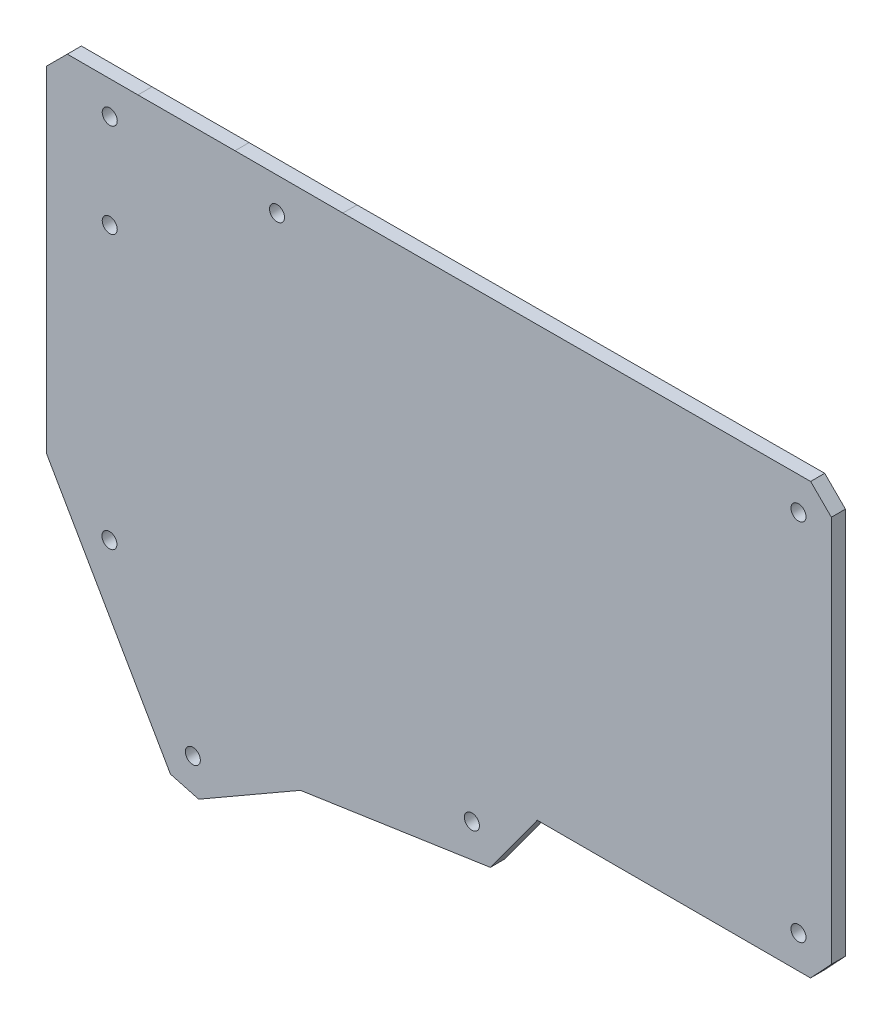
ISO-10303-21;
HEADER;
FILE_DESCRIPTION(('STEP AP214'),'2;1');
FILE_NAME('part.step','',(''),(''),'','','');
FILE_SCHEMA(('AUTOMOTIVE_DESIGN { 1 0 10303 214 1 1 1 1 }'));
ENDSEC;
DATA;
#1=APPLICATION_CONTEXT('core data for automotive mechanical design processes');
#2=APPLICATION_PROTOCOL_DEFINITION('international standard','automotive_design',2000,#1);
#3=PRODUCT_CONTEXT('',#1,'mechanical');
#4=PRODUCT('Part','Part','',(#3));
#5=PRODUCT_RELATED_PRODUCT_CATEGORY('part','',(#4));
#6=PRODUCT_DEFINITION_FORMATION('','',#4);
#7=PRODUCT_DEFINITION_CONTEXT('part definition',#1,'design');
#8=PRODUCT_DEFINITION('design','',#6,#7);
#9=PRODUCT_DEFINITION_SHAPE('','',#8);
#10=(LENGTH_UNIT() NAMED_UNIT(*) SI_UNIT(.MILLI.,.METRE.));
#11=(NAMED_UNIT(*) PLANE_ANGLE_UNIT() SI_UNIT($,.RADIAN.));
#12=(NAMED_UNIT(*) SI_UNIT($,.STERADIAN.) SOLID_ANGLE_UNIT());
#13=UNCERTAINTY_MEASURE_WITH_UNIT(LENGTH_MEASURE(1.E-05),#10,'distance_accuracy_value','');
#14=(GEOMETRIC_REPRESENTATION_CONTEXT(3) GLOBAL_UNCERTAINTY_ASSIGNED_CONTEXT((#13)) GLOBAL_UNIT_ASSIGNED_CONTEXT((#10,
#11,#12)) REPRESENTATION_CONTEXT('',''));
#15=CARTESIAN_POINT('',(0.,0.,0.));
#16=DIRECTION('',(0.,0.,1.));
#17=DIRECTION('',(1.,0.,0.));
#18=AXIS2_PLACEMENT_3D('',#15,#16,#17);
#19=CARTESIAN_POINT('',(7.66089303925564,0.,3.));
#20=DIRECTION('',(-1.,0.,0.));
#21=DIRECTION('',(0.,0.,1.));
#22=AXIS2_PLACEMENT_3D('',#19,#20,#21);
#23=PLANE('',#22);
#24=DIRECTION('',(0.,1.,0.));
#25=VECTOR('',#24,1.);
#26=CARTESIAN_POINT('',(7.66089303925564,0.,0.));
#27=LINE('',#26,#25);
#28=CARTESIAN_POINT('',(7.66089303925565,-81.1960721287899,0.));
#29=VERTEX_POINT('',#28);
#30=CARTESIAN_POINT('',(7.66089303925564,1.26724378586505,0.));
#31=VERTEX_POINT('',#30);
#32=EDGE_CURVE('E198',#29,#31,#27,.T.);
#33=ORIENTED_EDGE('',*,*,#32,.T.);
#34=DIRECTION('',(0.,0.,-1.));
#35=VECTOR('',#34,1.);
#36=CARTESIAN_POINT('',(7.66089303925564,1.26724378586505,3.));
#37=LINE('',#36,#35);
#38=CARTESIAN_POINT('',(7.66089303925564,1.26724378586505,3.));
#39=VERTEX_POINT('',#38);
#40=EDGE_CURVE('E11',#39,#31,#37,.T.);
#41=ORIENTED_EDGE('',*,*,#40,.F.);
#42=DIRECTION('',(0.,1.,0.));
#43=VECTOR('',#42,1.);
#44=CARTESIAN_POINT('',(7.66089303925564,0.,3.));
#45=LINE('',#44,#43);
#46=CARTESIAN_POINT('',(7.66089303925565,-81.1960721287899,3.));
#47=VERTEX_POINT('',#46);
#48=EDGE_CURVE('E600',#47,#39,#45,.T.);
#49=ORIENTED_EDGE('',*,*,#48,.F.);
#50=DIRECTION('',(0.,0.,-1.));
#51=VECTOR('',#50,1.);
#52=CARTESIAN_POINT('',(7.66089303925565,-81.1960721287899,3.));
#53=LINE('',#52,#51);
#54=EDGE_CURVE('E51',#47,#29,#53,.T.);
#55=ORIENTED_EDGE('',*,*,#54,.T.);
#56=EDGE_LOOP('',(#33,#41,#49,#55));
#57=FACE_BOUND('',#56,.T.);
#58=ADVANCED_FACE('F34',(#57),#23,.F.);
#59=CARTESIAN_POINT('',(4.4524616072334,4.46597032094939,3.));
#60=DIRECTION('',(-0.706034919401094,-0.708177020656764,0.));
#61=DIRECTION('',(0.708177020656764,-0.706034919401094,0.));
#62=AXIS2_PLACEMENT_3D('',#59,#60,#61);
#63=PLANE('',#62);
#64=DIRECTION('',(-0.708177020656764,0.706034919401094,0.));
#65=VECTOR('',#64,1.);
#66=CARTESIAN_POINT('',(4.4524616072334,4.46597032094939,0.));
#67=LINE('',#66,#65);
#68=CARTESIAN_POINT('',(3.24884614344241,5.6659450761024,0.));
#69=VERTEX_POINT('',#68);
#70=EDGE_CURVE('E200',#31,#69,#67,.T.);
#71=ORIENTED_EDGE('',*,*,#70,.T.);
#72=DIRECTION('',(0.,0.,-1.));
#73=VECTOR('',#72,1.);
#74=CARTESIAN_POINT('',(3.24884614344241,5.6659450761024,3.));
#75=LINE('',#74,#73);
#76=CARTESIAN_POINT('',(3.24884614344241,5.6659450761024,3.));
#77=VERTEX_POINT('',#76);
#78=EDGE_CURVE('E43',#77,#69,#75,.T.);
#79=ORIENTED_EDGE('',*,*,#78,.F.);
#80=DIRECTION('',(-0.708177020656764,0.706034919401094,0.));
#81=VECTOR('',#80,1.);
#82=CARTESIAN_POINT('',(4.4524616072334,4.46597032094939,3.));
#83=LINE('',#82,#81);
#84=EDGE_CURVE('E110',#39,#77,#83,.T.);
#85=ORIENTED_EDGE('',*,*,#84,.F.);
#86=ORIENTED_EDGE('',*,*,#40,.T.);
#87=EDGE_LOOP('',(#71,#79,#85,#86));
#88=FACE_BOUND('',#87,.T.);
#89=ADVANCED_FACE('F318',(#88),#63,.F.);
#90=CARTESIAN_POINT('',(-0.0171344360139464,5.65605111756165,3.));
#91=DIRECTION('',(0.00302938517258272,-0.99999541140221,0.));
#92=DIRECTION('',(0.99999541140221,0.00302938517258272,0.));
#93=AXIS2_PLACEMENT_3D('',#90,#91,#92);
#94=PLANE('',#93);
#95=DIRECTION('',(-0.99999541140221,-0.00302938517258272,0.));
#96=VECTOR('',#95,1.);
#97=CARTESIAN_POINT('',(-0.0171344360139464,5.65605111756165,0.));
#98=LINE('',#97,#96);
#99=CARTESIAN_POINT('',(-96.3671470307811,5.36416847869687,0.));
#100=VERTEX_POINT('',#99);
#101=EDGE_CURVE('E202',#69,#100,#98,.T.);
#102=ORIENTED_EDGE('',*,*,#101,.T.);
#103=DIRECTION('',(0.,0.,-1.));
#104=VECTOR('',#103,1.);
#105=CARTESIAN_POINT('',(-96.3671470307811,5.36416847869687,3.));
#106=LINE('',#105,#104);
#107=CARTESIAN_POINT('',(-96.3671470307811,5.36416847869687,3.));
#108=VERTEX_POINT('',#107);
#109=EDGE_CURVE('E257',#108,#100,#106,.T.);
#110=ORIENTED_EDGE('',*,*,#109,.F.);
#111=DIRECTION('',(-0.99999541140221,-0.00302938517258272,0.));
#112=VECTOR('',#111,1.);
#113=CARTESIAN_POINT('',(-0.0171344360139464,5.65605111756165,3.));
#114=LINE('',#113,#112);
#115=EDGE_CURVE('E264',#77,#108,#114,.T.);
#116=ORIENTED_EDGE('',*,*,#115,.F.);
#117=ORIENTED_EDGE('',*,*,#78,.T.);
#118=EDGE_LOOP('',(#102,#110,#116,#117));
#119=FACE_BOUND('',#118,.T.);
#120=ADVANCED_FACE('F262',(#119),#94,.F.);
#121=CARTESIAN_POINT('',(0.,5.36416847869687,3.));
#122=DIRECTION('',(0.,1.,0.));
#123=DIRECTION('',(0.,0.,1.));
#124=AXIS2_PLACEMENT_3D('',#121,#122,#123);
#125=PLANE('',#124);
#126=DIRECTION('',(1.,0.,0.));
#127=VECTOR('',#126,1.);
#128=CARTESIAN_POINT('',(0.,5.36416847869687,0.));
#129=LINE('',#128,#127);
#130=CARTESIAN_POINT('',(-119.344550333397,5.36416847869687,0.));
#131=VERTEX_POINT('',#130);
#132=EDGE_CURVE('E205',#131,#100,#129,.T.);
#133=ORIENTED_EDGE('',*,*,#132,.F.);
#134=DIRECTION('',(0.,0.,-1.));
#135=VECTOR('',#134,1.);
#136=CARTESIAN_POINT('',(-119.344550333397,5.36416847869687,3.));
#137=LINE('',#136,#135);
#138=CARTESIAN_POINT('',(-119.344550333397,5.36416847869687,3.));
#139=VERTEX_POINT('',#138);
#140=EDGE_CURVE('E255',#139,#131,#137,.T.);
#141=ORIENTED_EDGE('',*,*,#140,.F.);
#142=DIRECTION('',(1.,0.,0.));
#143=VECTOR('',#142,1.);
#144=CARTESIAN_POINT('',(0.,5.36416847869687,3.));
#145=LINE('',#144,#143);
#146=EDGE_CURVE('E274',#139,#108,#145,.T.);
#147=ORIENTED_EDGE('',*,*,#146,.T.);
#148=ORIENTED_EDGE('',*,*,#109,.T.);
#149=EDGE_LOOP('',(#133,#141,#147,#148));
#150=FACE_BOUND('',#149,.T.);
#151=ADVANCED_FACE('F271',(#150),#125,.T.);
#152=CARTESIAN_POINT('',(-0.0117608863754863,5.61415436888448,3.));
#153=DIRECTION('',(-0.00209485877957112,0.999997805780939,0.));
#154=DIRECTION('',(-0.99999780578094,-0.00209485877957112,0.));
#155=AXIS2_PLACEMENT_3D('',#152,#153,#154);
#156=PLANE('',#155);
#157=DIRECTION('',(0.99999780578094,0.00209485877957112,0.));
#158=VECTOR('',#157,1.);
#159=CARTESIAN_POINT('',(-0.0117608863754863,5.61415436888448,0.));
#160=LINE('',#159,#158);
#161=CARTESIAN_POINT('',(-140.021777649489,5.32085251247185,0.));
#162=VERTEX_POINT('',#161);
#163=EDGE_CURVE('E208',#162,#131,#160,.T.);
#164=ORIENTED_EDGE('',*,*,#163,.F.);
#165=DIRECTION('',(0.,0.,-1.));
#166=VECTOR('',#165,1.);
#167=CARTESIAN_POINT('',(-140.021777649489,5.32085251247185,3.));
#168=LINE('',#167,#166);
#169=CARTESIAN_POINT('',(-140.021777649489,5.32085251247185,3.));
#170=VERTEX_POINT('',#169);
#171=EDGE_CURVE('E253',#170,#162,#168,.T.);
#172=ORIENTED_EDGE('',*,*,#171,.F.);
#173=DIRECTION('',(0.99999780578094,0.00209485877957112,0.));
#174=VECTOR('',#173,1.);
#175=CARTESIAN_POINT('',(-0.0117608863754863,5.61415436888448,3.));
#176=LINE('',#175,#174);
#177=EDGE_CURVE('E277',#170,#139,#176,.T.);
#178=ORIENTED_EDGE('',*,*,#177,.T.);
#179=ORIENTED_EDGE('',*,*,#140,.T.);
#180=EDGE_LOOP('',(#164,#172,#178,#179));
#181=FACE_BOUND('',#180,.T.);
#182=ADVANCED_FACE('F519',(#181),#156,.T.);
#183=CARTESIAN_POINT('',(0.,5.32085251247185,3.));
#184=DIRECTION('',(0.,-1.,0.));
#185=DIRECTION('',(0.,0.,-1.));
#186=AXIS2_PLACEMENT_3D('',#183,#184,#185);
#187=PLANE('',#186);
#188=DIRECTION('',(-1.,0.,0.));
#189=VECTOR('',#188,1.);
#190=CARTESIAN_POINT('',(0.,5.32085251247185,0.));
#191=LINE('',#190,#189);
#192=CARTESIAN_POINT('',(-155.064772312705,5.32085251247185,0.));
#193=VERTEX_POINT('',#192);
#194=EDGE_CURVE('E211',#162,#193,#191,.T.);
#195=ORIENTED_EDGE('',*,*,#194,.T.);
#196=DIRECTION('',(0.,0.,-1.));
#197=VECTOR('',#196,1.);
#198=CARTESIAN_POINT('',(-155.064772312705,5.32085251247185,3.));
#199=LINE('',#198,#197);
#200=CARTESIAN_POINT('',(-155.064772312705,5.32085251247185,3.));
#201=VERTEX_POINT('',#200);
#202=EDGE_CURVE('E250',#201,#193,#199,.T.);
#203=ORIENTED_EDGE('',*,*,#202,.F.);
#204=DIRECTION('',(-1.,0.,0.));
#205=VECTOR('',#204,1.);
#206=CARTESIAN_POINT('',(0.,5.32085251247185,3.));
#207=LINE('',#206,#205);
#208=EDGE_CURVE('E279',#170,#201,#207,.T.);
#209=ORIENTED_EDGE('',*,*,#208,.F.);
#210=ORIENTED_EDGE('',*,*,#171,.T.);
#211=EDGE_LOOP('',(#195,#203,#209,#210));
#212=FACE_BOUND('',#211,.T.);
#213=ADVANCED_FACE('F509',(#212),#187,.F.);
#214=CARTESIAN_POINT('',(-80.1928124125885,80.1928124125884,3.));
#215=DIRECTION('',(0.707106781186548,-0.707106781186547,0.));
#216=DIRECTION('',(0.707106781186547,0.707106781186548,0.));
#217=AXIS2_PLACEMENT_3D('',#214,#215,#216);
#218=PLANE('',#217);
#219=DIRECTION('',(-0.707106781186547,-0.707106781186548,0.));
#220=VECTOR('',#219,1.);
#221=CARTESIAN_POINT('',(-80.1928124125885,80.1928124125884,0.));
#222=LINE('',#221,#220);
#223=CARTESIAN_POINT('',(-159.478985875078,0.906638950098765,0.));
#224=VERTEX_POINT('',#223);
#225=EDGE_CURVE('E213',#193,#224,#222,.T.);
#226=ORIENTED_EDGE('',*,*,#225,.T.);
#227=DIRECTION('',(0.,0.,-1.));
#228=VECTOR('',#227,1.);
#229=CARTESIAN_POINT('',(-159.478985875078,0.906638950098765,3.));
#230=LINE('',#229,#228);
#231=CARTESIAN_POINT('',(-159.478985875078,0.906638950098765,3.));
#232=VERTEX_POINT('',#231);
#233=EDGE_CURVE('E247',#232,#224,#230,.T.);
#234=ORIENTED_EDGE('',*,*,#233,.F.);
#235=DIRECTION('',(-0.707106781186547,-0.707106781186548,0.));
#236=VECTOR('',#235,1.);
#237=CARTESIAN_POINT('',(-80.1928124125885,80.1928124125884,3.));
#238=LINE('',#237,#236);
#239=EDGE_CURVE('E285',#201,#232,#238,.T.);
#240=ORIENTED_EDGE('',*,*,#239,.F.);
#241=ORIENTED_EDGE('',*,*,#202,.T.);
#242=EDGE_LOOP('',(#226,#234,#240,#241));
#243=FACE_BOUND('',#242,.T.);
#244=ADVANCED_FACE('F498',(#243),#218,.F.);
#245=CARTESIAN_POINT('',(-159.478985875078,0.,3.));
#246=DIRECTION('',(1.,0.,0.));
#247=DIRECTION('',(0.,0.,-1.));
#248=AXIS2_PLACEMENT_3D('',#245,#246,#247);
#249=PLANE('',#248);
#250=DIRECTION('',(0.,-1.,0.));
#251=VECTOR('',#250,1.);
#252=CARTESIAN_POINT('',(-159.478985875078,0.,0.));
#253=LINE('',#252,#251);
#254=CARTESIAN_POINT('',(-159.478985875078,-70.5743208912734,0.));
#255=VERTEX_POINT('',#254);
#256=EDGE_CURVE('E215',#224,#255,#253,.T.);
#257=ORIENTED_EDGE('',*,*,#256,.T.);
#258=DIRECTION('',(0.,0.,-1.));
#259=VECTOR('',#258,1.);
#260=CARTESIAN_POINT('',(-159.478985875078,-70.5743208912734,3.));
#261=LINE('',#260,#259);
#262=CARTESIAN_POINT('',(-159.478985875078,-70.5743208912734,3.));
#263=VERTEX_POINT('',#262);
#264=EDGE_CURVE('E244',#263,#255,#261,.T.);
#265=ORIENTED_EDGE('',*,*,#264,.F.);
#266=DIRECTION('',(0.,-1.,0.));
#267=VECTOR('',#266,1.);
#268=CARTESIAN_POINT('',(-159.478985875078,0.,3.));
#269=LINE('',#268,#267);
#270=EDGE_CURVE('E287',#232,#263,#269,.T.);
#271=ORIENTED_EDGE('',*,*,#270,.F.);
#272=ORIENTED_EDGE('',*,*,#233,.T.);
#273=EDGE_LOOP('',(#257,#265,#271,#272));
#274=FACE_BOUND('',#273,.T.);
#275=ADVANCED_FACE('F488',(#274),#249,.F.);
#276=CARTESIAN_POINT('',(-150.385282970097,-86.4021560626533,3.));
#277=DIRECTION('',(0.867079117153433,0.498170457370188,0.));
#278=DIRECTION('',(-0.498170457370188,0.867079117153434,0.));
#279=AXIS2_PLACEMENT_3D('',#276,#277,#278);
#280=PLANE('',#279);
#281=DIRECTION('',(0.498170457370188,-0.867079117153434,0.));
#282=VECTOR('',#281,1.);
#283=CARTESIAN_POINT('',(-150.385282970097,-86.4021560626533,0.));
#284=LINE('',#283,#282);
#285=CARTESIAN_POINT('',(-133.100653392858,-116.486520023682,0.));
#286=VERTEX_POINT('',#285);
#287=EDGE_CURVE('E217',#255,#286,#284,.T.);
#288=ORIENTED_EDGE('',*,*,#287,.T.);
#289=DIRECTION('',(0.,0.,-1.));
#290=VECTOR('',#289,1.);
#291=CARTESIAN_POINT('',(-133.100653392858,-116.486520023682,3.));
#292=LINE('',#291,#290);
#293=CARTESIAN_POINT('',(-133.100653392858,-116.486520023682,3.));
#294=VERTEX_POINT('',#293);
#295=EDGE_CURVE('E241',#294,#286,#292,.T.);
#296=ORIENTED_EDGE('',*,*,#295,.F.);
#297=DIRECTION('',(0.498170457370188,-0.867079117153434,0.));
#298=VECTOR('',#297,1.);
#299=CARTESIAN_POINT('',(-150.385282970097,-86.4021560626533,3.));
#300=LINE('',#299,#298);
#301=EDGE_CURVE('E289',#263,#294,#300,.T.);
#302=ORIENTED_EDGE('',*,*,#301,.F.);
#303=ORIENTED_EDGE('',*,*,#264,.T.);
#304=EDGE_LOOP('',(#288,#296,#302,#303));
#305=FACE_BOUND('',#304,.T.);
#306=ADVANCED_FACE('F478',(#305),#280,.F.);
#307=CARTESIAN_POINT('',(-38.3262179573216,-142.056284095759,3.));
#308=DIRECTION('',(0.260482277203311,0.965478629107334,0.));
#309=DIRECTION('',(-0.965478629107334,0.260482277203311,0.));
#310=AXIS2_PLACEMENT_3D('',#307,#308,#309);
#311=PLANE('',#310);
#312=DIRECTION('',(0.965478629107334,-0.260482277203311,0.));
#313=VECTOR('',#312,1.);
#314=CARTESIAN_POINT('',(-38.3262179573216,-142.056284095759,0.));
#315=LINE('',#314,#313);
#316=CARTESIAN_POINT('',(-127.076613357529,-118.111781960155,0.));
#317=VERTEX_POINT('',#316);
#318=EDGE_CURVE('E219',#286,#317,#315,.T.);
#319=ORIENTED_EDGE('',*,*,#318,.T.);
#320=DIRECTION('',(0.,0.,-1.));
#321=VECTOR('',#320,1.);
#322=CARTESIAN_POINT('',(-127.076613357529,-118.111781960155,3.));
#323=LINE('',#322,#321);
#324=CARTESIAN_POINT('',(-127.076613357529,-118.111781960155,3.));
#325=VERTEX_POINT('',#324);
#326=EDGE_CURVE('E238',#325,#317,#323,.T.);
#327=ORIENTED_EDGE('',*,*,#326,.F.);
#328=DIRECTION('',(0.965478629107334,-0.260482277203311,0.));
#329=VECTOR('',#328,1.);
#330=CARTESIAN_POINT('',(-38.3262179573216,-142.056284095759,3.));
#331=LINE('',#330,#329);
#332=EDGE_CURVE('E291',#294,#325,#331,.T.);
#333=ORIENTED_EDGE('',*,*,#332,.F.);
#334=ORIENTED_EDGE('',*,*,#295,.T.);
#335=EDGE_LOOP('',(#319,#327,#333,#334));
#336=FACE_BOUND('',#335,.T.);
#337=ADVANCED_FACE('F469',(#336),#311,.F.);
#338=CARTESIAN_POINT('',(19.4424470319471,-33.7792379449592,3.));
#339=DIRECTION('',(-0.498844869486857,0.86669129232192,0.));
#340=DIRECTION('',(-0.86669129232192,-0.498844869486857,0.));
#341=AXIS2_PLACEMENT_3D('',#338,#339,#340);
#342=PLANE('',#341);
#343=DIRECTION('',(0.86669129232192,0.498844869486857,0.));
#344=VECTOR('',#343,1.);
#345=CARTESIAN_POINT('',(19.4424470319471,-33.7792379449592,0.));
#346=LINE('',#345,#344);
#347=CARTESIAN_POINT('',(-105.412894174079,-105.642711064432,0.));
#348=VERTEX_POINT('',#347);
#349=EDGE_CURVE('E221',#317,#348,#346,.T.);
#350=ORIENTED_EDGE('',*,*,#349,.T.);
#351=DIRECTION('',(0.,0.,-1.));
#352=VECTOR('',#351,1.);
#353=CARTESIAN_POINT('',(-105.412894174079,-105.642711064432,3.));
#354=LINE('',#353,#352);
#355=CARTESIAN_POINT('',(-105.412894174079,-105.642711064432,3.));
#356=VERTEX_POINT('',#355);
#357=EDGE_CURVE('E235',#356,#348,#354,.T.);
#358=ORIENTED_EDGE('',*,*,#357,.F.);
#359=DIRECTION('',(0.86669129232192,0.498844869486857,0.));
#360=VECTOR('',#359,1.);
#361=CARTESIAN_POINT('',(19.4424470319471,-33.7792379449592,3.));
#362=LINE('',#361,#360);
#363=EDGE_CURVE('E293',#325,#356,#362,.T.);
#364=ORIENTED_EDGE('',*,*,#363,.F.);
#365=ORIENTED_EDGE('',*,*,#326,.T.);
#366=EDGE_LOOP('',(#350,#358,#364,#365));
#367=FACE_BOUND('',#366,.T.);
#368=ADVANCED_FACE('F299',(#367),#342,.F.);
#369=CARTESIAN_POINT('',(13.0852967169432,-88.0280539294065,3.));
#370=DIRECTION('',(-0.147033571925685,0.989131502241625,0.));
#371=DIRECTION('',(-0.989131502241625,-0.147033571925685,0.));
#372=AXIS2_PLACEMENT_3D('',#369,#370,#371);
#373=PLANE('',#372);
#374=DIRECTION('',(0.989131502241625,0.147033571925685,0.));
#375=VECTOR('',#374,1.);
#376=CARTESIAN_POINT('',(13.0852967169432,-88.0280539294065,0.));
#377=LINE('',#376,#375);
#378=CARTESIAN_POINT('',(-64.9706233499997,-99.6310012740001,0.));
#379=VERTEX_POINT('',#378);
#380=EDGE_CURVE('E223',#348,#379,#377,.T.);
#381=ORIENTED_EDGE('',*,*,#380,.T.);
#382=DIRECTION('',(0.,0.,-1.));
#383=VECTOR('',#382,1.);
#384=CARTESIAN_POINT('',(-64.9706233499997,-99.6310012740001,3.));
#385=LINE('',#384,#383);
#386=CARTESIAN_POINT('',(-64.9706233499997,-99.6310012740001,3.));
#387=VERTEX_POINT('',#386);
#388=EDGE_CURVE('E166',#387,#379,#385,.T.);
#389=ORIENTED_EDGE('',*,*,#388,.F.);
#390=DIRECTION('',(0.989131502241625,0.147033571925685,0.));
#391=VECTOR('',#390,1.);
#392=CARTESIAN_POINT('',(13.0852967169432,-88.0280539294065,3.));
#393=LINE('',#392,#391);
#394=EDGE_CURVE('E154',#356,#387,#393,.T.);
#395=ORIENTED_EDGE('',*,*,#394,.F.);
#396=ORIENTED_EDGE('',*,*,#357,.T.);
#397=EDGE_LOOP('',(#381,#389,#395,#396));
#398=FACE_BOUND('',#397,.T.);
#399=ADVANCED_FACE('F303',(#398),#373,.F.);
#400=CARTESIAN_POINT('',(5.06145758509057,-3.6947927449223,3.));
#401=DIRECTION('',(-0.807692408581894,0.589604081667672,0.));
#402=DIRECTION('',(-0.589604081667672,-0.807692408581894,0.));
#403=AXIS2_PLACEMENT_3D('',#400,#401,#402);
#404=PLANE('',#403);
#405=DIRECTION('',(0.589604081667672,0.807692408581894,0.));
#406=VECTOR('',#405,1.);
#407=CARTESIAN_POINT('',(5.06145758509057,-3.6947927449223,0.));
#408=LINE('',#407,#406);
#409=CARTESIAN_POINT('',(-54.9717380120555,-85.9336337814013,0.));
#410=VERTEX_POINT('',#409);
#411=EDGE_CURVE('E163',#379,#410,#408,.T.);
#412=ORIENTED_EDGE('',*,*,#411,.T.);
#413=DIRECTION('',(0.,0.,-1.));
#414=VECTOR('',#413,1.);
#415=CARTESIAN_POINT('',(-54.9717380120555,-85.9336337814013,3.));
#416=LINE('',#415,#414);
#417=CARTESIAN_POINT('',(-54.9717380120555,-85.9336337814013,3.));
#418=VERTEX_POINT('',#417);
#419=EDGE_CURVE('E160',#418,#410,#416,.T.);
#420=ORIENTED_EDGE('',*,*,#419,.F.);
#421=DIRECTION('',(0.589604081667672,0.807692408581894,0.));
#422=VECTOR('',#421,1.);
#423=CARTESIAN_POINT('',(5.06145758509057,-3.6947927449223,3.));
#424=LINE('',#423,#422);
#425=EDGE_CURVE('E147',#387,#418,#424,.T.);
#426=ORIENTED_EDGE('',*,*,#425,.F.);
#427=ORIENTED_EDGE('',*,*,#388,.T.);
#428=EDGE_LOOP('',(#412,#420,#426,#427));
#429=FACE_BOUND('',#428,.T.);
#430=ADVANCED_FACE('F161',(#429),#404,.F.);
#431=CARTESIAN_POINT('',(0.,-85.9336337814013,3.));
#432=DIRECTION('',(0.,-1.,0.));
#433=DIRECTION('',(0.,0.,-1.));
#434=AXIS2_PLACEMENT_3D('',#431,#432,#433);
#435=PLANE('',#434);
#436=DIRECTION('',(-1.,0.,0.));
#437=VECTOR('',#436,1.);
#438=CARTESIAN_POINT('',(0.,-85.9336337814013,0.));
#439=LINE('',#438,#437);
#440=CARTESIAN_POINT('',(3.22714570308626,-85.9336337814013,0.));
#441=VERTEX_POINT('',#440);
#442=EDGE_CURVE('E226',#441,#410,#439,.T.);
#443=ORIENTED_EDGE('',*,*,#442,.F.);
#444=DIRECTION('',(0.,0.,-1.));
#445=VECTOR('',#444,1.);
#446=CARTESIAN_POINT('',(3.22714570308626,-85.9336337814013,3.));
#447=LINE('',#446,#445);
#448=CARTESIAN_POINT('',(3.22714570308626,-85.9336337814013,3.));
#449=VERTEX_POINT('',#448);
#450=EDGE_CURVE('E98',#449,#441,#447,.T.);
#451=ORIENTED_EDGE('',*,*,#450,.F.);
#452=DIRECTION('',(-1.,0.,0.));
#453=VECTOR('',#452,1.);
#454=CARTESIAN_POINT('',(0.,-85.9336337814013,3.));
#455=LINE('',#454,#453);
#456=EDGE_CURVE('E152',#449,#418,#455,.T.);
#457=ORIENTED_EDGE('',*,*,#456,.T.);
#458=ORIENTED_EDGE('',*,*,#419,.T.);
#459=EDGE_LOOP('',(#443,#451,#457,#458));
#460=FACE_BOUND('',#459,.T.);
#461=ADVANCED_FACE('F168',(#460),#435,.T.);
#462=CARTESIAN_POINT('',(0.660893039255643,-1.34192698696502,3.));
#463=DIRECTION('',(0.,0.,-1.));
#464=DIRECTION('',(-1.,0.,0.));
#465=AXIS2_PLACEMENT_3D('',#462,#463,#464);
#466=CYLINDRICAL_SURFACE('',#465,1.6);
#467=CARTESIAN_POINT('',(0.660893039255643,-1.34192698696502,3.));
#468=DIRECTION('',(0.,0.,1.));
#469=DIRECTION('',(1.,0.,0.));
#470=AXIS2_PLACEMENT_3D('',#467,#468,#469);
#471=CIRCLE('',#470,1.6);
#472=CARTESIAN_POINT('',(2.26089303925564,-1.34192698696502,3.));
#473=VERTEX_POINT('',#472);
#474=EDGE_CURVE('E597',#473,#473,#471,.T.);
#475=ORIENTED_EDGE('',*,*,#474,.T.);
#476=EDGE_LOOP('',(#475));
#477=FACE_BOUND('',#476,.T.);
#478=CARTESIAN_POINT('',(0.660893039255643,-1.34192698696502,0.));
#479=DIRECTION('',(0.,0.,1.));
#480=DIRECTION('',(1.,0.,0.));
#481=AXIS2_PLACEMENT_3D('',#478,#479,#480);
#482=CIRCLE('',#481,1.6);
#483=CARTESIAN_POINT('',(2.26089303925564,-1.34192698696502,0.));
#484=VERTEX_POINT('',#483);
#485=EDGE_CURVE('E195',#484,#484,#482,.T.);
#486=ORIENTED_EDGE('',*,*,#485,.F.);
#487=EDGE_LOOP('',(#486));
#488=FACE_BOUND('',#487,.T.);
#489=ADVANCED_FACE('F326',(#477,#488),#466,.F.);
#490=CARTESIAN_POINT('',(-110.397084987784,-1.67836592268011,3.));
#491=DIRECTION('',(0.,0.,-1.));
#492=DIRECTION('',(-1.,0.,0.));
#493=AXIS2_PLACEMENT_3D('',#490,#491,#492);
#494=CYLINDRICAL_SURFACE('',#493,1.60000000000001);
#495=CARTESIAN_POINT('',(-110.397084987784,-1.67836592268011,3.));
#496=DIRECTION('',(0.,0.,1.));
#497=DIRECTION('',(1.,0.,0.));
#498=AXIS2_PLACEMENT_3D('',#495,#496,#497);
#499=CIRCLE('',#498,1.60000000000001);
#500=CARTESIAN_POINT('',(-108.797084987784,-1.67836592268011,3.));
#501=VERTEX_POINT('',#500);
#502=EDGE_CURVE('E594',#501,#501,#499,.T.);
#503=ORIENTED_EDGE('',*,*,#502,.T.);
#504=EDGE_LOOP('',(#503));
#505=FACE_BOUND('',#504,.T.);
#506=CARTESIAN_POINT('',(-110.397084987784,-1.67836592268011,0.));
#507=DIRECTION('',(0.,0.,1.));
#508=DIRECTION('',(1.,0.,0.));
#509=AXIS2_PLACEMENT_3D('',#506,#507,#508);
#510=CIRCLE('',#509,1.60000000000001);
#511=CARTESIAN_POINT('',(-108.797084987784,-1.67836592268011,0.));
#512=VERTEX_POINT('',#511);
#513=EDGE_CURVE('E192',#512,#512,#510,.T.);
#514=ORIENTED_EDGE('',*,*,#513,.F.);
#515=EDGE_LOOP('',(#514));
#516=FACE_BOUND('',#515,.T.);
#517=ADVANCED_FACE('F329',(#505,#516),#494,.F.);
#518=CARTESIAN_POINT('',(0.660893039255866,-78.9336337814017,3.));
#519=DIRECTION('',(0.,0.,-1.));
#520=DIRECTION('',(-1.,0.,0.));
#521=AXIS2_PLACEMENT_3D('',#518,#519,#520);
#522=CYLINDRICAL_SURFACE('',#521,1.6);
#523=CARTESIAN_POINT('',(0.660893039255866,-78.9336337814017,3.));
#524=DIRECTION('',(0.,0.,1.));
#525=DIRECTION('',(1.,0.,0.));
#526=AXIS2_PLACEMENT_3D('',#523,#524,#525);
#527=CIRCLE('',#526,1.6);
#528=CARTESIAN_POINT('',(2.26089303925587,-78.9336337814017,3.));
#529=VERTEX_POINT('',#528);
#530=EDGE_CURVE('E591',#529,#529,#527,.T.);
#531=ORIENTED_EDGE('',*,*,#530,.T.);
#532=EDGE_LOOP('',(#531));
#533=FACE_BOUND('',#532,.T.);
#534=CARTESIAN_POINT('',(0.660893039255866,-78.9336337814017,0.));
#535=DIRECTION('',(0.,0.,1.));
#536=DIRECTION('',(1.,0.,0.));
#537=AXIS2_PLACEMENT_3D('',#534,#535,#536);
#538=CIRCLE('',#537,1.6);
#539=CARTESIAN_POINT('',(2.26089303925587,-78.9336337814017,0.));
#540=VERTEX_POINT('',#539);
#541=EDGE_CURVE('E189',#540,#540,#538,.T.);
#542=ORIENTED_EDGE('',*,*,#541,.F.);
#543=EDGE_LOOP('',(#542));
#544=FACE_BOUND('',#543,.T.);
#545=ADVANCED_FACE('F333',(#533,#544),#522,.F.);
#546=CARTESIAN_POINT('',(-68.8973348654548,-93.1377882225448,3.));
#547=DIRECTION('',(0.,0.,-1.));
#548=DIRECTION('',(-1.,0.,0.));
#549=AXIS2_PLACEMENT_3D('',#546,#547,#548);
#550=CYLINDRICAL_SURFACE('',#549,1.60000000000001);
#551=CARTESIAN_POINT('',(-68.8973348654548,-93.1377882225448,3.));
#552=DIRECTION('',(0.,0.,1.));
#553=DIRECTION('',(1.,0.,0.));
#554=AXIS2_PLACEMENT_3D('',#551,#552,#553);
#555=CIRCLE('',#554,1.60000000000001);
#556=CARTESIAN_POINT('',(-67.2973348654548,-93.1377882225448,3.));
#557=VERTEX_POINT('',#556);
#558=EDGE_CURVE('E588',#557,#557,#555,.T.);
#559=ORIENTED_EDGE('',*,*,#558,.T.);
#560=EDGE_LOOP('',(#559));
#561=FACE_BOUND('',#560,.T.);
#562=CARTESIAN_POINT('',(-68.8973348654548,-93.1377882225448,0.));
#563=DIRECTION('',(0.,0.,1.));
#564=DIRECTION('',(1.,0.,0.));
#565=AXIS2_PLACEMENT_3D('',#562,#563,#564);
#566=CIRCLE('',#565,1.60000000000001);
#567=CARTESIAN_POINT('',(-67.2973348654548,-93.1377882225448,0.));
#568=VERTEX_POINT('',#567);
#569=EDGE_CURVE('E186',#568,#568,#566,.T.);
#570=ORIENTED_EDGE('',*,*,#569,.F.);
#571=EDGE_LOOP('',(#570));
#572=FACE_BOUND('',#571,.T.);
#573=ADVANCED_FACE('F337',(#561,#572),#550,.F.);
#574=CARTESIAN_POINT('',(-128.322250167988,-110.752044387657,3.));
#575=DIRECTION('',(0.,0.,-1.));
#576=DIRECTION('',(-1.,0.,0.));
#577=AXIS2_PLACEMENT_3D('',#574,#575,#576);
#578=CYLINDRICAL_SURFACE('',#577,1.59999999999999);
#579=CARTESIAN_POINT('',(-128.322250167988,-110.752044387657,3.));
#580=DIRECTION('',(0.,0.,1.));
#581=DIRECTION('',(1.,0.,0.));
#582=AXIS2_PLACEMENT_3D('',#579,#580,#581);
#583=CIRCLE('',#582,1.59999999999999);
#584=CARTESIAN_POINT('',(-126.722250167988,-110.752044387657,3.));
#585=VERTEX_POINT('',#584);
#586=EDGE_CURVE('E581',#585,#585,#583,.T.);
#587=ORIENTED_EDGE('',*,*,#586,.T.);
#588=EDGE_LOOP('',(#587));
#589=FACE_BOUND('',#588,.T.);
#590=CARTESIAN_POINT('',(-128.322250167988,-110.752044387657,0.));
#591=DIRECTION('',(0.,0.,1.));
#592=DIRECTION('',(1.,0.,0.));
#593=AXIS2_PLACEMENT_3D('',#590,#591,#592);
#594=CIRCLE('',#593,1.59999999999999);
#595=CARTESIAN_POINT('',(-126.722250167988,-110.752044387657,0.));
#596=VERTEX_POINT('',#595);
#597=EDGE_CURVE('E183',#596,#596,#594,.T.);
#598=ORIENTED_EDGE('',*,*,#597,.F.);
#599=EDGE_LOOP('',(#598));
#600=FACE_BOUND('',#599,.T.);
#601=ADVANCED_FACE('F341',(#589,#600),#578,.F.);
#602=CARTESIAN_POINT('',(-146.092378900102,-79.8226560532257,3.));
#603=DIRECTION('',(0.,0.,-1.));
#604=DIRECTION('',(-1.,0.,0.));
#605=AXIS2_PLACEMENT_3D('',#602,#603,#604);
#606=CYLINDRICAL_SURFACE('',#605,1.59999999999999);
#607=CARTESIAN_POINT('',(-146.092378900102,-79.8226560532257,3.));
#608=DIRECTION('',(0.,0.,1.));
#609=DIRECTION('',(1.,0.,0.));
#610=AXIS2_PLACEMENT_3D('',#607,#608,#609);
#611=CIRCLE('',#610,1.59999999999999);
#612=CARTESIAN_POINT('',(-144.492378900102,-79.8226560532257,3.));
#613=VERTEX_POINT('',#612);
#614=EDGE_CURVE('E578',#613,#613,#611,.T.);
#615=ORIENTED_EDGE('',*,*,#614,.T.);
#616=EDGE_LOOP('',(#615));
#617=FACE_BOUND('',#616,.T.);
#618=CARTESIAN_POINT('',(-146.092378900102,-79.8226560532257,0.));
#619=DIRECTION('',(0.,0.,1.));
#620=DIRECTION('',(1.,0.,0.));
#621=AXIS2_PLACEMENT_3D('',#618,#619,#620);
#622=CIRCLE('',#621,1.59999999999999);
#623=CARTESIAN_POINT('',(-144.492378900102,-79.8226560532257,0.));
#624=VERTEX_POINT('',#623);
#625=EDGE_CURVE('E180',#624,#624,#622,.T.);
#626=ORIENTED_EDGE('',*,*,#625,.F.);
#627=EDGE_LOOP('',(#626));
#628=FACE_BOUND('',#627,.T.);
#629=ADVANCED_FACE('F345',(#617,#628),#606,.F.);
#630=CARTESIAN_POINT('',(-146.022825080028,-1.67786818578665,3.));
#631=DIRECTION('',(0.,0.,-1.));
#632=DIRECTION('',(-1.,0.,0.));
#633=AXIS2_PLACEMENT_3D('',#630,#631,#632);
#634=CYLINDRICAL_SURFACE('',#633,1.59999999999999);
#635=CARTESIAN_POINT('',(-146.022825080028,-1.67786818578665,3.));
#636=DIRECTION('',(0.,0.,1.));
#637=DIRECTION('',(1.,0.,0.));
#638=AXIS2_PLACEMENT_3D('',#635,#636,#637);
#639=CIRCLE('',#638,1.59999999999999);
#640=CARTESIAN_POINT('',(-144.422825080028,-1.67786818578665,3.));
#641=VERTEX_POINT('',#640);
#642=EDGE_CURVE('E356',#641,#641,#639,.T.);
#643=ORIENTED_EDGE('',*,*,#642,.T.);
#644=EDGE_LOOP('',(#643));
#645=FACE_BOUND('',#644,.T.);
#646=CARTESIAN_POINT('',(-146.022825080028,-1.67786818578665,0.));
#647=DIRECTION('',(0.,0.,1.));
#648=DIRECTION('',(1.,0.,0.));
#649=AXIS2_PLACEMENT_3D('',#646,#647,#648);
#650=CIRCLE('',#649,1.59999999999999);
#651=CARTESIAN_POINT('',(-144.422825080028,-1.67786818578665,0.));
#652=VERTEX_POINT('',#651);
#653=EDGE_CURVE('E177',#652,#652,#650,.T.);
#654=ORIENTED_EDGE('',*,*,#653,.F.);
#655=EDGE_LOOP('',(#654));
#656=FACE_BOUND('',#655,.T.);
#657=ADVANCED_FACE('F313',(#645,#656),#634,.F.);
#658=CARTESIAN_POINT('',(-146.022825080028,-21.6778681857867,3.));
#659=DIRECTION('',(0.,0.,-1.));
#660=DIRECTION('',(-1.,0.,0.));
#661=AXIS2_PLACEMENT_3D('',#658,#659,#660);
#662=CYLINDRICAL_SURFACE('',#661,1.59999999999999);
#663=CARTESIAN_POINT('',(-146.022825080028,-21.6778681857867,3.));
#664=DIRECTION('',(0.,0.,1.));
#665=DIRECTION('',(1.,0.,0.));
#666=AXIS2_PLACEMENT_3D('',#663,#664,#665);
#667=CIRCLE('',#666,1.59999999999999);
#668=CARTESIAN_POINT('',(-144.422825080028,-21.6778681857867,3.));
#669=VERTEX_POINT('',#668);
#670=EDGE_CURVE('E231',#669,#669,#667,.T.);
#671=ORIENTED_EDGE('',*,*,#670,.T.);
#672=EDGE_LOOP('',(#671));
#673=FACE_BOUND('',#672,.T.);
#674=CARTESIAN_POINT('',(-146.022825080028,-21.6778681857867,0.));
#675=DIRECTION('',(0.,0.,1.));
#676=DIRECTION('',(1.,0.,0.));
#677=AXIS2_PLACEMENT_3D('',#674,#675,#676);
#678=CIRCLE('',#677,1.59999999999999);
#679=CARTESIAN_POINT('',(-144.422825080028,-21.6778681857867,0.));
#680=VERTEX_POINT('',#679);
#681=EDGE_CURVE('E174',#680,#680,#678,.T.);
#682=ORIENTED_EDGE('',*,*,#681,.F.);
#683=EDGE_LOOP('',(#682));
#684=FACE_BOUND('',#683,.T.);
#685=ADVANCED_FACE('F36',(#673,#684),#662,.F.);
#686=CARTESIAN_POINT('',(44.5929791516328,-41.7332832843298,3.));
#687=DIRECTION('',(0.730130324767502,-0.683307916575611,0.));
#688=DIRECTION('',(0.683307916575611,0.730130324767502,0.));
#689=AXIS2_PLACEMENT_3D('',#686,#687,#688);
#690=PLANE('',#689);
#691=DIRECTION('',(-0.683307916575611,-0.730130324767502,0.));
#692=VECTOR('',#691,1.);
#693=CARTESIAN_POINT('',(44.5929791516328,-41.7332832843298,0.));
#694=LINE('',#693,#692);
#695=EDGE_CURVE('E228',#29,#441,#694,.T.);
#696=ORIENTED_EDGE('',*,*,#695,.F.);
#697=ORIENTED_EDGE('',*,*,#54,.F.);
#698=DIRECTION('',(-0.683307916575611,-0.730130324767502,0.));
#699=VECTOR('',#698,1.);
#700=CARTESIAN_POINT('',(44.5929791516328,-41.7332832843298,3.));
#701=LINE('',#700,#699);
#702=EDGE_CURVE('E169',#47,#449,#701,.T.);
#703=ORIENTED_EDGE('',*,*,#702,.T.);
#704=ORIENTED_EDGE('',*,*,#450,.T.);
#705=EDGE_LOOP('',(#696,#697,#703,#704));
#706=FACE_BOUND('',#705,.T.);
#707=ADVANCED_FACE('F304',(#706),#690,.T.);
#708=CARTESIAN_POINT('',(0.,0.,3.));
#709=DIRECTION('',(0.,0.,1.));
#710=DIRECTION('',(1.,0.,0.));
#711=AXIS2_PLACEMENT_3D('',#708,#709,#710);
#712=PLANE('',#711);
#713=ORIENTED_EDGE('',*,*,#670,.F.);
#714=EDGE_LOOP('',(#713));
#715=FACE_BOUND('',#714,.T.);
#716=ORIENTED_EDGE('',*,*,#642,.F.);
#717=EDGE_LOOP('',(#716));
#718=FACE_BOUND('',#717,.T.);
#719=ORIENTED_EDGE('',*,*,#614,.F.);
#720=EDGE_LOOP('',(#719));
#721=FACE_BOUND('',#720,.T.);
#722=ORIENTED_EDGE('',*,*,#586,.F.);
#723=EDGE_LOOP('',(#722));
#724=FACE_BOUND('',#723,.T.);
#725=ORIENTED_EDGE('',*,*,#558,.F.);
#726=EDGE_LOOP('',(#725));
#727=FACE_BOUND('',#726,.T.);
#728=ORIENTED_EDGE('',*,*,#530,.F.);
#729=EDGE_LOOP('',(#728));
#730=FACE_BOUND('',#729,.T.);
#731=ORIENTED_EDGE('',*,*,#502,.F.);
#732=EDGE_LOOP('',(#731));
#733=FACE_BOUND('',#732,.T.);
#734=ORIENTED_EDGE('',*,*,#474,.F.);
#735=EDGE_LOOP('',(#734));
#736=FACE_BOUND('',#735,.T.);
#737=ORIENTED_EDGE('',*,*,#48,.T.);
#738=ORIENTED_EDGE('',*,*,#84,.T.);
#739=ORIENTED_EDGE('',*,*,#115,.T.);
#740=ORIENTED_EDGE('',*,*,#146,.F.);
#741=ORIENTED_EDGE('',*,*,#177,.F.);
#742=ORIENTED_EDGE('',*,*,#208,.T.);
#743=ORIENTED_EDGE('',*,*,#239,.T.);
#744=ORIENTED_EDGE('',*,*,#270,.T.);
#745=ORIENTED_EDGE('',*,*,#301,.T.);
#746=ORIENTED_EDGE('',*,*,#332,.T.);
#747=ORIENTED_EDGE('',*,*,#363,.T.);
#748=ORIENTED_EDGE('',*,*,#394,.T.);
#749=ORIENTED_EDGE('',*,*,#425,.T.);
#750=ORIENTED_EDGE('',*,*,#456,.F.);
#751=ORIENTED_EDGE('',*,*,#702,.F.);
#752=EDGE_LOOP('',(#737,#738,#739,#740,#741,#742,#743,#744,#745,#746,#747,#748,#749,#750,#751));
#753=FACE_BOUND('',#752,.T.);
#754=ADVANCED_FACE('F149',(#715,#718,#721,#724,#727,#730,#733,#736,#753),#712,.T.);
#755=CARTESIAN_POINT('',(0.,0.,0.));
#756=DIRECTION('',(0.,0.,1.));
#757=DIRECTION('',(1.,0.,0.));
#758=AXIS2_PLACEMENT_3D('',#755,#756,#757);
#759=PLANE('',#758);
#760=ORIENTED_EDGE('',*,*,#681,.T.);
#761=EDGE_LOOP('',(#760));
#762=FACE_BOUND('',#761,.T.);
#763=ORIENTED_EDGE('',*,*,#653,.T.);
#764=EDGE_LOOP('',(#763));
#765=FACE_BOUND('',#764,.T.);
#766=ORIENTED_EDGE('',*,*,#625,.T.);
#767=EDGE_LOOP('',(#766));
#768=FACE_BOUND('',#767,.T.);
#769=ORIENTED_EDGE('',*,*,#597,.T.);
#770=EDGE_LOOP('',(#769));
#771=FACE_BOUND('',#770,.T.);
#772=ORIENTED_EDGE('',*,*,#569,.T.);
#773=EDGE_LOOP('',(#772));
#774=FACE_BOUND('',#773,.T.);
#775=ORIENTED_EDGE('',*,*,#541,.T.);
#776=EDGE_LOOP('',(#775));
#777=FACE_BOUND('',#776,.T.);
#778=ORIENTED_EDGE('',*,*,#513,.T.);
#779=EDGE_LOOP('',(#778));
#780=FACE_BOUND('',#779,.T.);
#781=ORIENTED_EDGE('',*,*,#485,.T.);
#782=EDGE_LOOP('',(#781));
#783=FACE_BOUND('',#782,.T.);
#784=ORIENTED_EDGE('',*,*,#32,.F.);
#785=ORIENTED_EDGE('',*,*,#695,.T.);
#786=ORIENTED_EDGE('',*,*,#442,.T.);
#787=ORIENTED_EDGE('',*,*,#411,.F.);
#788=ORIENTED_EDGE('',*,*,#380,.F.);
#789=ORIENTED_EDGE('',*,*,#349,.F.);
#790=ORIENTED_EDGE('',*,*,#318,.F.);
#791=ORIENTED_EDGE('',*,*,#287,.F.);
#792=ORIENTED_EDGE('',*,*,#256,.F.);
#793=ORIENTED_EDGE('',*,*,#225,.F.);
#794=ORIENTED_EDGE('',*,*,#194,.F.);
#795=ORIENTED_EDGE('',*,*,#163,.T.);
#796=ORIENTED_EDGE('',*,*,#132,.T.);
#797=ORIENTED_EDGE('',*,*,#101,.F.);
#798=ORIENTED_EDGE('',*,*,#70,.F.);
#799=EDGE_LOOP('',(#784,#785,#786,#787,#788,#789,#790,#791,#792,#793,#794,#795,#796,#797,#798));
#800=FACE_BOUND('',#799,.T.);
#801=ADVANCED_FACE('F266',(#762,#765,#768,#771,#774,#777,#780,#783,#800),#759,.F.);
#802=CLOSED_SHELL('',(#58,#89,#120,#151,#182,#213,#244,#275,#306,#337,#368,#399,#430,#461,#489,
#517,#545,#573,#601,#629,#657,#685,#707,#754,#801));
#803=MANIFOLD_SOLID_BREP('B2',#802);
#804=ADVANCED_BREP_SHAPE_REPRESENTATION('',(#18,#803),#14);
#805=SHAPE_DEFINITION_REPRESENTATION(#9,#804);
ENDSEC;
END-ISO-10303-21;
